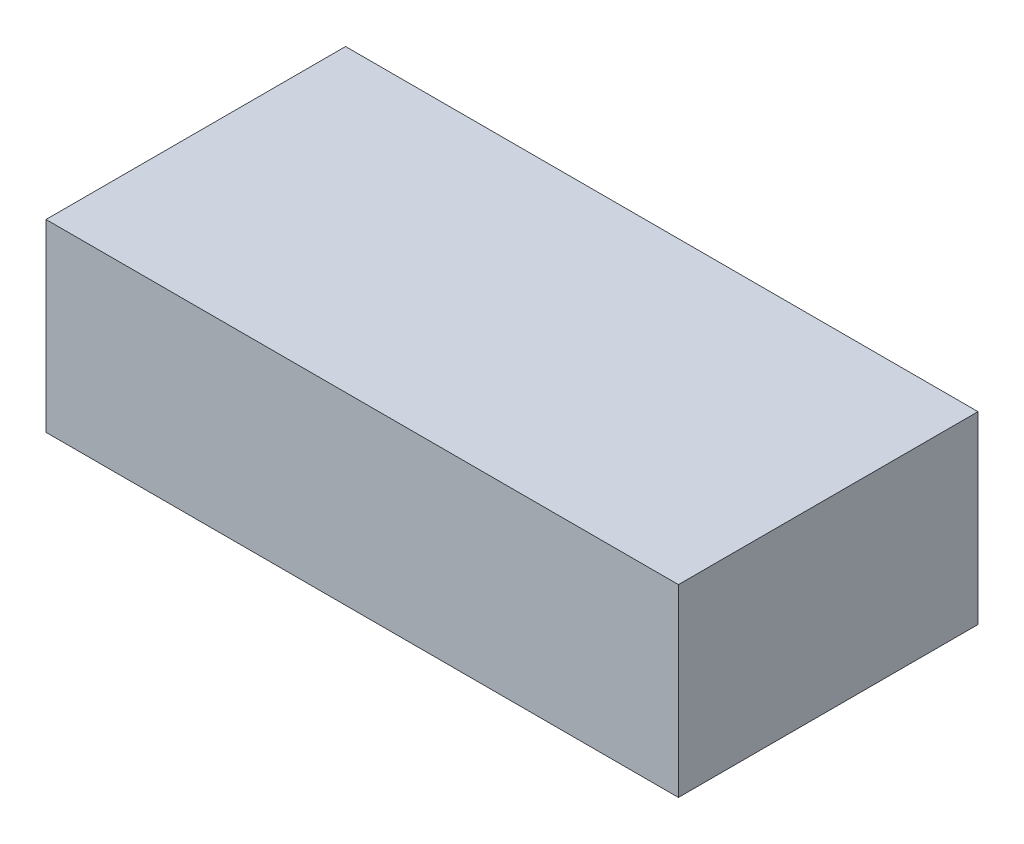
ISO-10303-21;
HEADER;
FILE_DESCRIPTION(('STEP AP214'),'2;1');
FILE_NAME('part.step','',(''),(''),'','','');
FILE_SCHEMA(('AUTOMOTIVE_DESIGN { 1 0 10303 214 1 1 1 1 }'));
ENDSEC;
DATA;
#1=APPLICATION_CONTEXT('core data for automotive mechanical design processes');
#2=APPLICATION_PROTOCOL_DEFINITION('international standard','automotive_design',2000,#1);
#3=PRODUCT_CONTEXT('',#1,'mechanical');
#4=PRODUCT('Part','Part','',(#3));
#5=PRODUCT_RELATED_PRODUCT_CATEGORY('part','',(#4));
#6=PRODUCT_DEFINITION_FORMATION('','',#4);
#7=PRODUCT_DEFINITION_CONTEXT('part definition',#1,'design');
#8=PRODUCT_DEFINITION('design','',#6,#7);
#9=PRODUCT_DEFINITION_SHAPE('','',#8);
#10=(LENGTH_UNIT() NAMED_UNIT(*) SI_UNIT(.MILLI.,.METRE.));
#11=(NAMED_UNIT(*) PLANE_ANGLE_UNIT() SI_UNIT($,.RADIAN.));
#12=(NAMED_UNIT(*) SI_UNIT($,.STERADIAN.) SOLID_ANGLE_UNIT());
#13=UNCERTAINTY_MEASURE_WITH_UNIT(LENGTH_MEASURE(1.E-05),#10,'distance_accuracy_value','');
#14=(GEOMETRIC_REPRESENTATION_CONTEXT(3) GLOBAL_UNCERTAINTY_ASSIGNED_CONTEXT((#13)) GLOBAL_UNIT_ASSIGNED_CONTEXT((#10,
#11,#12)) REPRESENTATION_CONTEXT('',''));
#15=CARTESIAN_POINT('',(0.,0.,0.));
#16=DIRECTION('',(0.,0.,1.));
#17=DIRECTION('',(1.,0.,0.));
#18=AXIS2_PLACEMENT_3D('',#15,#16,#17);
#19=CARTESIAN_POINT('',(-52.5850574928294,33.,-24.3497310557929));
#20=DIRECTION('',(1.,0.,0.));
#21=DIRECTION('',(0.,0.,-1.));
#22=AXIS2_PLACEMENT_3D('',#19,#20,#21);
#23=PLANE('',#22);
#24=DIRECTION('',(0.,0.,1.));
#25=VECTOR('',#24,1.);
#26=CARTESIAN_POINT('',(-52.5850574928294,0.,-24.3497310557929));
#27=LINE('',#26,#25);
#28=CARTESIAN_POINT('',(-52.5850574928294,0.,-24.3497310557929));
#29=VERTEX_POINT('',#28);
#30=CARTESIAN_POINT('',(-52.5850574928294,0.,29.2714852053681));
#31=VERTEX_POINT('',#30);
#32=EDGE_CURVE('E100',#29,#31,#27,.T.);
#33=ORIENTED_EDGE('',*,*,#32,.T.);
#34=DIRECTION('',(0.,-1.,0.));
#35=VECTOR('',#34,1.);
#36=CARTESIAN_POINT('',(-52.5850574928294,33.,29.2714852053681));
#37=LINE('',#36,#35);
#38=CARTESIAN_POINT('',(-52.5850574928294,33.,29.2714852053681));
#39=VERTEX_POINT('',#38);
#40=EDGE_CURVE('E11',#39,#31,#37,.T.);
#41=ORIENTED_EDGE('',*,*,#40,.F.);
#42=DIRECTION('',(0.,0.,1.));
#43=VECTOR('',#42,1.);
#44=CARTESIAN_POINT('',(-52.5850574928294,33.,-24.3497310557929));
#45=LINE('',#44,#43);
#46=CARTESIAN_POINT('',(-52.5850574928294,33.,-24.3497310557929));
#47=VERTEX_POINT('',#46);
#48=EDGE_CURVE('E88',#47,#39,#45,.T.);
#49=ORIENTED_EDGE('',*,*,#48,.F.);
#50=DIRECTION('',(0.,-1.,0.));
#51=VECTOR('',#50,1.);
#52=CARTESIAN_POINT('',(-52.5850574928294,33.,-24.3497310557929));
#53=LINE('',#52,#51);
#54=EDGE_CURVE('E96',#47,#29,#53,.T.);
#55=ORIENTED_EDGE('',*,*,#54,.T.);
#56=EDGE_LOOP('',(#33,#41,#49,#55));
#57=FACE_BOUND('',#56,.T.);
#58=ADVANCED_FACE('F37',(#57),#23,.F.);
#59=CARTESIAN_POINT('',(-52.5850574928294,33.,29.2714852053681));
#60=DIRECTION('',(0.,0.,-1.));
#61=DIRECTION('',(-1.,0.,0.));
#62=AXIS2_PLACEMENT_3D('',#59,#60,#61);
#63=PLANE('',#62);
#64=DIRECTION('',(1.,0.,0.));
#65=VECTOR('',#64,1.);
#66=CARTESIAN_POINT('',(-52.5850574928294,0.,29.2714852053681));
#67=LINE('',#66,#65);
#68=CARTESIAN_POINT('',(60.6152879473994,0.,29.2714852053681));
#69=VERTEX_POINT('',#68);
#70=EDGE_CURVE('E92',#31,#69,#67,.T.);
#71=ORIENTED_EDGE('',*,*,#70,.T.);
#72=DIRECTION('',(0.,-1.,0.));
#73=VECTOR('',#72,1.);
#74=CARTESIAN_POINT('',(60.6152879473994,33.,29.2714852053681));
#75=LINE('',#74,#73);
#76=CARTESIAN_POINT('',(60.6152879473994,33.,29.2714852053681));
#77=VERTEX_POINT('',#76);
#78=EDGE_CURVE('E45',#77,#69,#75,.T.);
#79=ORIENTED_EDGE('',*,*,#78,.F.);
#80=DIRECTION('',(1.,0.,0.));
#81=VECTOR('',#80,1.);
#82=CARTESIAN_POINT('',(-52.5850574928294,33.,29.2714852053681));
#83=LINE('',#82,#81);
#84=EDGE_CURVE('E83',#39,#77,#83,.T.);
#85=ORIENTED_EDGE('',*,*,#84,.F.);
#86=ORIENTED_EDGE('',*,*,#40,.T.);
#87=EDGE_LOOP('',(#71,#79,#85,#86));
#88=FACE_BOUND('',#87,.T.);
#89=ADVANCED_FACE('F91',(#88),#63,.F.);
#90=CARTESIAN_POINT('',(60.6152879473994,33.,-24.3497310557929));
#91=DIRECTION('',(-1.,0.,0.));
#92=DIRECTION('',(0.,0.,1.));
#93=AXIS2_PLACEMENT_3D('',#90,#91,#92);
#94=PLANE('',#93);
#95=DIRECTION('',(0.,0.,-1.));
#96=VECTOR('',#95,1.);
#97=CARTESIAN_POINT('',(60.6152879473994,0.,-24.3497310557929));
#98=LINE('',#97,#96);
#99=CARTESIAN_POINT('',(60.6152879473994,0.,-24.3497310557929));
#100=VERTEX_POINT('',#99);
#101=EDGE_CURVE('E70',#69,#100,#98,.T.);
#102=ORIENTED_EDGE('',*,*,#101,.T.);
#103=DIRECTION('',(0.,-1.,0.));
#104=VECTOR('',#103,1.);
#105=CARTESIAN_POINT('',(60.6152879473994,33.,-24.3497310557929));
#106=LINE('',#105,#104);
#107=CARTESIAN_POINT('',(60.6152879473994,33.,-24.3497310557929));
#108=VERTEX_POINT('',#107);
#109=EDGE_CURVE('E93',#108,#100,#106,.T.);
#110=ORIENTED_EDGE('',*,*,#109,.F.);
#111=DIRECTION('',(0.,0.,-1.));
#112=VECTOR('',#111,1.);
#113=CARTESIAN_POINT('',(60.6152879473994,33.,-24.3497310557929));
#114=LINE('',#113,#112);
#115=EDGE_CURVE('E86',#77,#108,#114,.T.);
#116=ORIENTED_EDGE('',*,*,#115,.F.);
#117=ORIENTED_EDGE('',*,*,#78,.T.);
#118=EDGE_LOOP('',(#102,#110,#116,#117));
#119=FACE_BOUND('',#118,.T.);
#120=ADVANCED_FACE('F94',(#119),#94,.F.);
#121=CARTESIAN_POINT('',(-52.5850574928294,33.,-24.3497310557929));
#122=DIRECTION('',(0.,0.,1.));
#123=DIRECTION('',(1.,0.,0.));
#124=AXIS2_PLACEMENT_3D('',#121,#122,#123);
#125=PLANE('',#124);
#126=DIRECTION('',(-1.,0.,0.));
#127=VECTOR('',#126,1.);
#128=CARTESIAN_POINT('',(-52.5850574928294,0.,-24.3497310557929));
#129=LINE('',#128,#127);
#130=EDGE_CURVE('E76',#100,#29,#129,.T.);
#131=ORIENTED_EDGE('',*,*,#130,.T.);
#132=ORIENTED_EDGE('',*,*,#54,.F.);
#133=DIRECTION('',(-1.,0.,0.));
#134=VECTOR('',#133,1.);
#135=CARTESIAN_POINT('',(-52.5850574928294,33.,-24.3497310557929));
#136=LINE('',#135,#134);
#137=EDGE_CURVE('E53',#108,#47,#136,.T.);
#138=ORIENTED_EDGE('',*,*,#137,.F.);
#139=ORIENTED_EDGE('',*,*,#109,.T.);
#140=EDGE_LOOP('',(#131,#132,#138,#139));
#141=FACE_BOUND('',#140,.T.);
#142=ADVANCED_FACE('F107',(#141),#125,.F.);
#143=CARTESIAN_POINT('',(0.,33.,0.));
#144=DIRECTION('',(0.,1.,0.));
#145=DIRECTION('',(0.,0.,1.));
#146=AXIS2_PLACEMENT_3D('',#143,#144,#145);
#147=PLANE('',#146);
#148=ORIENTED_EDGE('',*,*,#48,.T.);
#149=ORIENTED_EDGE('',*,*,#84,.T.);
#150=ORIENTED_EDGE('',*,*,#115,.T.);
#151=ORIENTED_EDGE('',*,*,#137,.T.);
#152=EDGE_LOOP('',(#148,#149,#150,#151));
#153=FACE_BOUND('',#152,.T.);
#154=ADVANCED_FACE('F84',(#153),#147,.T.);
#155=CARTESIAN_POINT('',(0.,0.,0.));
#156=DIRECTION('',(0.,1.,0.));
#157=DIRECTION('',(0.,0.,1.));
#158=AXIS2_PLACEMENT_3D('',#155,#156,#157);
#159=PLANE('',#158);
#160=ORIENTED_EDGE('',*,*,#32,.F.);
#161=ORIENTED_EDGE('',*,*,#130,.F.);
#162=ORIENTED_EDGE('',*,*,#101,.F.);
#163=ORIENTED_EDGE('',*,*,#70,.F.);
#164=EDGE_LOOP('',(#160,#161,#162,#163));
#165=FACE_BOUND('',#164,.T.);
#166=ADVANCED_FACE('F110',(#165),#159,.F.);
#167=CLOSED_SHELL('',(#58,#89,#120,#142,#154,#166));
#168=MANIFOLD_SOLID_BREP('B2',#167);
#169=ADVANCED_BREP_SHAPE_REPRESENTATION('',(#18,#168),#14);
#170=SHAPE_DEFINITION_REPRESENTATION(#9,#169);
ENDSEC;
END-ISO-10303-21;
